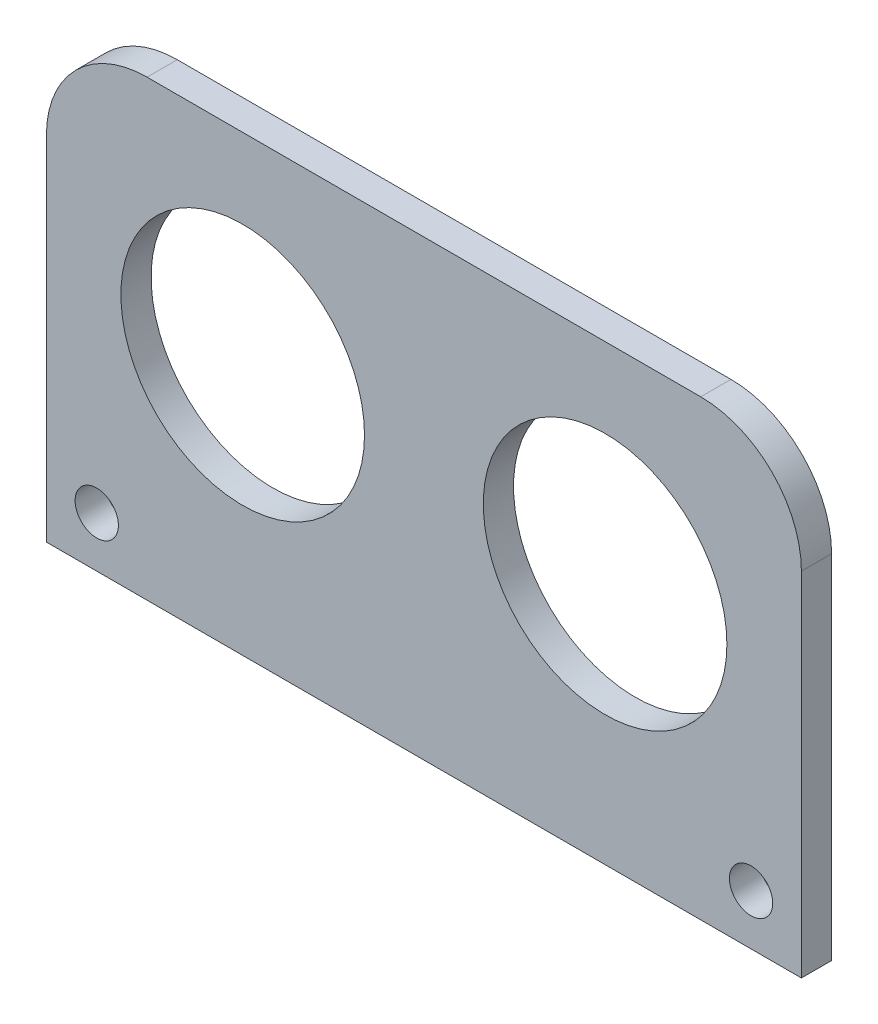
ISO-10303-21;
HEADER;
FILE_DESCRIPTION(('STEP AP214'),'2;1');
FILE_NAME('part.step','',(''),(''),'','','');
FILE_SCHEMA(('AUTOMOTIVE_DESIGN { 1 0 10303 214 1 1 1 1 }'));
ENDSEC;
DATA;
#1=APPLICATION_CONTEXT('core data for automotive mechanical design processes');
#2=APPLICATION_PROTOCOL_DEFINITION('international standard','automotive_design',2000,#1);
#3=PRODUCT_CONTEXT('',#1,'mechanical');
#4=PRODUCT('Part','Part','',(#3));
#5=PRODUCT_RELATED_PRODUCT_CATEGORY('part','',(#4));
#6=PRODUCT_DEFINITION_FORMATION('','',#4);
#7=PRODUCT_DEFINITION_CONTEXT('part definition',#1,'design');
#8=PRODUCT_DEFINITION('design','',#6,#7);
#9=PRODUCT_DEFINITION_SHAPE('','',#8);
#10=(LENGTH_UNIT() NAMED_UNIT(*) SI_UNIT(.MILLI.,.METRE.));
#11=(NAMED_UNIT(*) PLANE_ANGLE_UNIT() SI_UNIT($,.RADIAN.));
#12=(NAMED_UNIT(*) SI_UNIT($,.STERADIAN.) SOLID_ANGLE_UNIT());
#13=UNCERTAINTY_MEASURE_WITH_UNIT(LENGTH_MEASURE(1.E-05),#10,'distance_accuracy_value','');
#14=(GEOMETRIC_REPRESENTATION_CONTEXT(3) GLOBAL_UNCERTAINTY_ASSIGNED_CONTEXT((#13)) GLOBAL_UNIT_ASSIGNED_CONTEXT((#10,
#11,#12)) REPRESENTATION_CONTEXT('',''));
#15=CARTESIAN_POINT('',(0.,0.,0.));
#16=DIRECTION('',(0.,0.,1.));
#17=DIRECTION('',(1.,0.,0.));
#18=AXIS2_PLACEMENT_3D('',#15,#16,#17);
#19=CARTESIAN_POINT('',(0.,0.,3.));
#20=DIRECTION('',(0.,0.,-1.));
#21=DIRECTION('',(-1.,0.,0.));
#22=AXIS2_PLACEMENT_3D('',#19,#20,#21);
#23=PLANE('',#22);
#24=DIRECTION('',(-1.,0.,0.));
#25=VECTOR('',#24,1.);
#26=CARTESIAN_POINT('',(0.,45.,3.));
#27=LINE('',#26,#25);
#28=CARTESIAN_POINT('',(65.,45.,3.));
#29=VERTEX_POINT('',#28);
#30=CARTESIAN_POINT('',(10.,45.,3.));
#31=VERTEX_POINT('',#30);
#32=EDGE_CURVE('E116',#29,#31,#27,.T.);
#33=ORIENTED_EDGE('',*,*,#32,.T.);
#34=CARTESIAN_POINT('',(10.,35.,3.));
#35=DIRECTION('',(0.,0.,-1.));
#36=DIRECTION('',(-1.,0.,0.));
#37=AXIS2_PLACEMENT_3D('',#34,#35,#36);
#38=CIRCLE('',#37,10.);
#39=CARTESIAN_POINT('',(0.,35.,3.));
#40=VERTEX_POINT('',#39);
#41=EDGE_CURVE('E42',#31,#40,#38,.F.);
#42=ORIENTED_EDGE('',*,*,#41,.T.);
#43=DIRECTION('',(0.,-1.,0.));
#44=VECTOR('',#43,1.);
#45=CARTESIAN_POINT('',(0.,0.,3.));
#46=LINE('',#45,#44);
#47=CARTESIAN_POINT('',(0.,0.,3.));
#48=VERTEX_POINT('',#47);
#49=EDGE_CURVE('E88',#40,#48,#46,.T.);
#50=ORIENTED_EDGE('',*,*,#49,.T.);
#51=DIRECTION('',(1.,0.,0.));
#52=VECTOR('',#51,1.);
#53=CARTESIAN_POINT('',(0.,0.,3.));
#54=LINE('',#53,#52);
#55=CARTESIAN_POINT('',(75.,0.,3.));
#56=VERTEX_POINT('',#55);
#57=EDGE_CURVE('E91',#48,#56,#54,.T.);
#58=ORIENTED_EDGE('',*,*,#57,.T.);
#59=DIRECTION('',(0.,1.,0.));
#60=VECTOR('',#59,1.);
#61=CARTESIAN_POINT('',(75.,0.,3.));
#62=LINE('',#61,#60);
#63=CARTESIAN_POINT('',(75.,35.,3.));
#64=VERTEX_POINT('',#63);
#65=EDGE_CURVE('E106',#56,#64,#62,.T.);
#66=ORIENTED_EDGE('',*,*,#65,.T.);
#67=CARTESIAN_POINT('',(65.,35.,3.));
#68=DIRECTION('',(0.,0.,-1.));
#69=DIRECTION('',(-1.,0.,0.));
#70=AXIS2_PLACEMENT_3D('',#67,#68,#69);
#71=CIRCLE('',#70,10.);
#72=EDGE_CURVE('E127',#64,#29,#71,.F.);
#73=ORIENTED_EDGE('',*,*,#72,.T.);
#74=EDGE_LOOP('',(#33,#42,#50,#58,#66,#73));
#75=FACE_BOUND('',#74,.T.);
#76=CARTESIAN_POINT('',(19.5,25.,3.));
#77=DIRECTION('',(0.,0.,1.));
#78=DIRECTION('',(1.,0.,0.));
#79=AXIS2_PLACEMENT_3D('',#76,#77,#78);
#80=CIRCLE('',#79,12.1);
#81=CARTESIAN_POINT('',(31.6,25.,3.));
#82=VERTEX_POINT('',#81);
#83=EDGE_CURVE('E144',#82,#82,#80,.T.);
#84=ORIENTED_EDGE('',*,*,#83,.F.);
#85=EDGE_LOOP('',(#84));
#86=FACE_BOUND('',#85,.T.);
#87=CARTESIAN_POINT('',(55.5,25.,3.));
#88=DIRECTION('',(0.,0.,1.));
#89=DIRECTION('',(1.,0.,0.));
#90=AXIS2_PLACEMENT_3D('',#87,#88,#89);
#91=CIRCLE('',#90,12.1);
#92=CARTESIAN_POINT('',(67.6,25.,3.));
#93=VERTEX_POINT('',#92);
#94=EDGE_CURVE('E150',#93,#93,#91,.T.);
#95=ORIENTED_EDGE('',*,*,#94,.F.);
#96=EDGE_LOOP('',(#95));
#97=FACE_BOUND('',#96,.T.);
#98=CARTESIAN_POINT('',(5.,5.,3.));
#99=DIRECTION('',(0.,0.,1.));
#100=DIRECTION('',(1.,0.,0.));
#101=AXIS2_PLACEMENT_3D('',#98,#99,#100);
#102=CIRCLE('',#101,2.15);
#103=CARTESIAN_POINT('',(7.15,5.,3.));
#104=VERTEX_POINT('',#103);
#105=EDGE_CURVE('E156',#104,#104,#102,.T.);
#106=ORIENTED_EDGE('',*,*,#105,.F.);
#107=EDGE_LOOP('',(#106));
#108=FACE_BOUND('',#107,.T.);
#109=CARTESIAN_POINT('',(70.,5.00000000000001,3.));
#110=DIRECTION('',(0.,0.,1.));
#111=DIRECTION('',(-1.,0.,0.));
#112=AXIS2_PLACEMENT_3D('',#109,#110,#111);
#113=CIRCLE('',#112,2.15);
#114=CARTESIAN_POINT('',(67.85,5.00000000000001,3.));
#115=VERTEX_POINT('',#114);
#116=EDGE_CURVE('E162',#115,#115,#113,.T.);
#117=ORIENTED_EDGE('',*,*,#116,.F.);
#118=EDGE_LOOP('',(#117));
#119=FACE_BOUND('',#118,.T.);
#120=ADVANCED_FACE('F34',(#75,#86,#97,#108,#119),#23,.F.);
#121=CARTESIAN_POINT('',(0.,0.,0.));
#122=DIRECTION('',(0.,0.,-1.));
#123=DIRECTION('',(-1.,0.,0.));
#124=AXIS2_PLACEMENT_3D('',#121,#122,#123);
#125=PLANE('',#124);
#126=CARTESIAN_POINT('',(5.,5.,0.));
#127=DIRECTION('',(0.,0.,1.));
#128=DIRECTION('',(1.,0.,0.));
#129=AXIS2_PLACEMENT_3D('',#126,#127,#128);
#130=CIRCLE('',#129,2.15);
#131=CARTESIAN_POINT('',(7.15,5.,0.));
#132=VERTEX_POINT('',#131);
#133=EDGE_CURVE('E159',#132,#132,#130,.T.);
#134=ORIENTED_EDGE('',*,*,#133,.T.);
#135=EDGE_LOOP('',(#134));
#136=FACE_BOUND('',#135,.T.);
#137=CARTESIAN_POINT('',(19.5,25.,0.));
#138=DIRECTION('',(0.,0.,1.));
#139=DIRECTION('',(1.,0.,0.));
#140=AXIS2_PLACEMENT_3D('',#137,#138,#139);
#141=CIRCLE('',#140,12.1);
#142=CARTESIAN_POINT('',(31.6,25.,0.));
#143=VERTEX_POINT('',#142);
#144=EDGE_CURVE('E147',#143,#143,#141,.T.);
#145=ORIENTED_EDGE('',*,*,#144,.T.);
#146=EDGE_LOOP('',(#145));
#147=FACE_BOUND('',#146,.T.);
#148=DIRECTION('',(0.,-1.,0.));
#149=VECTOR('',#148,1.);
#150=CARTESIAN_POINT('',(0.,0.,0.));
#151=LINE('',#150,#149);
#152=CARTESIAN_POINT('',(0.,35.,0.));
#153=VERTEX_POINT('',#152);
#154=CARTESIAN_POINT('',(0.,0.,0.));
#155=VERTEX_POINT('',#154);
#156=EDGE_CURVE('E110',#153,#155,#151,.T.);
#157=ORIENTED_EDGE('',*,*,#156,.F.);
#158=CARTESIAN_POINT('',(10.,35.,0.));
#159=DIRECTION('',(0.,0.,-1.));
#160=DIRECTION('',(-1.,0.,0.));
#161=AXIS2_PLACEMENT_3D('',#158,#159,#160);
#162=CIRCLE('',#161,10.);
#163=CARTESIAN_POINT('',(10.,45.,0.));
#164=VERTEX_POINT('',#163);
#165=EDGE_CURVE('E121',#153,#164,#162,.T.);
#166=ORIENTED_EDGE('',*,*,#165,.T.);
#167=DIRECTION('',(-1.,0.,0.));
#168=VECTOR('',#167,1.);
#169=CARTESIAN_POINT('',(0.,45.,0.));
#170=LINE('',#169,#168);
#171=CARTESIAN_POINT('',(65.,45.,0.));
#172=VERTEX_POINT('',#171);
#173=EDGE_CURVE('E98',#172,#164,#170,.T.);
#174=ORIENTED_EDGE('',*,*,#173,.F.);
#175=CARTESIAN_POINT('',(65.,35.,0.));
#176=DIRECTION('',(0.,0.,-1.));
#177=DIRECTION('',(-1.,0.,0.));
#178=AXIS2_PLACEMENT_3D('',#175,#176,#177);
#179=CIRCLE('',#178,10.);
#180=CARTESIAN_POINT('',(75.,35.,0.));
#181=VERTEX_POINT('',#180);
#182=EDGE_CURVE('E114',#172,#181,#179,.T.);
#183=ORIENTED_EDGE('',*,*,#182,.T.);
#184=DIRECTION('',(0.,1.,0.));
#185=VECTOR('',#184,1.);
#186=CARTESIAN_POINT('',(75.,0.,0.));
#187=LINE('',#186,#185);
#188=CARTESIAN_POINT('',(75.,0.,0.));
#189=VERTEX_POINT('',#188);
#190=EDGE_CURVE('E138',#189,#181,#187,.T.);
#191=ORIENTED_EDGE('',*,*,#190,.F.);
#192=DIRECTION('',(1.,0.,0.));
#193=VECTOR('',#192,1.);
#194=CARTESIAN_POINT('',(0.,0.,0.));
#195=LINE('',#194,#193);
#196=EDGE_CURVE('E140',#155,#189,#195,.T.);
#197=ORIENTED_EDGE('',*,*,#196,.F.);
#198=EDGE_LOOP('',(#157,#166,#174,#183,#191,#197));
#199=FACE_BOUND('',#198,.T.);
#200=CARTESIAN_POINT('',(55.5,25.,0.));
#201=DIRECTION('',(0.,0.,1.));
#202=DIRECTION('',(1.,0.,0.));
#203=AXIS2_PLACEMENT_3D('',#200,#201,#202);
#204=CIRCLE('',#203,12.1);
#205=CARTESIAN_POINT('',(67.6,25.,0.));
#206=VERTEX_POINT('',#205);
#207=EDGE_CURVE('E153',#206,#206,#204,.T.);
#208=ORIENTED_EDGE('',*,*,#207,.T.);
#209=EDGE_LOOP('',(#208));
#210=FACE_BOUND('',#209,.T.);
#211=CARTESIAN_POINT('',(70.,5.00000000000001,0.));
#212=DIRECTION('',(0.,0.,1.));
#213=DIRECTION('',(-1.,0.,0.));
#214=AXIS2_PLACEMENT_3D('',#211,#212,#213);
#215=CIRCLE('',#214,2.15);
#216=CARTESIAN_POINT('',(67.85,5.00000000000001,0.));
#217=VERTEX_POINT('',#216);
#218=EDGE_CURVE('E165',#217,#217,#215,.T.);
#219=ORIENTED_EDGE('',*,*,#218,.T.);
#220=EDGE_LOOP('',(#219));
#221=FACE_BOUND('',#220,.T.);
#222=ADVANCED_FACE('F136',(#136,#147,#199,#210,#221),#125,.T.);
#223=CARTESIAN_POINT('',(0.,0.,3.));
#224=DIRECTION('',(1.,0.,0.));
#225=DIRECTION('',(0.,0.,-1.));
#226=AXIS2_PLACEMENT_3D('',#223,#224,#225);
#227=PLANE('',#226);
#228=ORIENTED_EDGE('',*,*,#49,.F.);
#229=DIRECTION('',(0.,0.,-1.));
#230=VECTOR('',#229,1.);
#231=CARTESIAN_POINT('',(0.,35.,3.));
#232=LINE('',#231,#230);
#233=EDGE_CURVE('E112',#40,#153,#232,.T.);
#234=ORIENTED_EDGE('',*,*,#233,.T.);
#235=ORIENTED_EDGE('',*,*,#156,.T.);
#236=DIRECTION('',(0.,0.,-1.));
#237=VECTOR('',#236,1.);
#238=CARTESIAN_POINT('',(0.,0.,3.));
#239=LINE('',#238,#237);
#240=EDGE_CURVE('E103',#48,#155,#239,.T.);
#241=ORIENTED_EDGE('',*,*,#240,.F.);
#242=EDGE_LOOP('',(#228,#234,#235,#241));
#243=FACE_BOUND('',#242,.T.);
#244=ADVANCED_FACE('F108',(#243),#227,.F.);
#245=CARTESIAN_POINT('',(0.,0.,3.));
#246=DIRECTION('',(0.,1.,0.));
#247=DIRECTION('',(-1.,0.,0.));
#248=AXIS2_PLACEMENT_3D('',#245,#246,#247);
#249=PLANE('',#248);
#250=ORIENTED_EDGE('',*,*,#196,.T.);
#251=DIRECTION('',(0.,0.,-1.));
#252=VECTOR('',#251,1.);
#253=CARTESIAN_POINT('',(75.,0.,3.));
#254=LINE('',#253,#252);
#255=EDGE_CURVE('E105',#56,#189,#254,.T.);
#256=ORIENTED_EDGE('',*,*,#255,.F.);
#257=ORIENTED_EDGE('',*,*,#57,.F.);
#258=ORIENTED_EDGE('',*,*,#240,.T.);
#259=EDGE_LOOP('',(#250,#256,#257,#258));
#260=FACE_BOUND('',#259,.T.);
#261=ADVANCED_FACE('F102',(#260),#249,.F.);
#262=CARTESIAN_POINT('',(75.,0.,3.));
#263=DIRECTION('',(-1.,0.,0.));
#264=DIRECTION('',(0.,-1.,0.));
#265=AXIS2_PLACEMENT_3D('',#262,#263,#264);
#266=PLANE('',#265);
#267=ORIENTED_EDGE('',*,*,#190,.T.);
#268=DIRECTION('',(0.,0.,-1.));
#269=VECTOR('',#268,1.);
#270=CARTESIAN_POINT('',(75.,35.,3.));
#271=LINE('',#270,#269);
#272=EDGE_CURVE('E11',#181,#64,#271,.F.);
#273=ORIENTED_EDGE('',*,*,#272,.T.);
#274=ORIENTED_EDGE('',*,*,#65,.F.);
#275=ORIENTED_EDGE('',*,*,#255,.T.);
#276=EDGE_LOOP('',(#267,#273,#274,#275));
#277=FACE_BOUND('',#276,.T.);
#278=ADVANCED_FACE('F139',(#277),#266,.F.);
#279=CARTESIAN_POINT('',(0.,45.,3.));
#280=DIRECTION('',(0.,-1.,0.));
#281=DIRECTION('',(1.,0.,0.));
#282=AXIS2_PLACEMENT_3D('',#279,#280,#281);
#283=PLANE('',#282);
#284=ORIENTED_EDGE('',*,*,#173,.T.);
#285=DIRECTION('',(0.,0.,-1.));
#286=VECTOR('',#285,1.);
#287=CARTESIAN_POINT('',(10.,45.,3.));
#288=LINE('',#287,#286);
#289=EDGE_CURVE('E55',#164,#31,#288,.F.);
#290=ORIENTED_EDGE('',*,*,#289,.T.);
#291=ORIENTED_EDGE('',*,*,#32,.F.);
#292=DIRECTION('',(0.,0.,-1.));
#293=VECTOR('',#292,1.);
#294=CARTESIAN_POINT('',(65.,45.,3.));
#295=LINE('',#294,#293);
#296=EDGE_CURVE('E123',#29,#172,#295,.T.);
#297=ORIENTED_EDGE('',*,*,#296,.T.);
#298=EDGE_LOOP('',(#284,#290,#291,#297));
#299=FACE_BOUND('',#298,.T.);
#300=ADVANCED_FACE('F131',(#299),#283,.F.);
#301=CARTESIAN_POINT('',(19.5,25.,3.));
#302=DIRECTION('',(0.,0.,-1.));
#303=DIRECTION('',(-1.,0.,0.));
#304=AXIS2_PLACEMENT_3D('',#301,#302,#303);
#305=CYLINDRICAL_SURFACE('',#304,12.1);
#306=ORIENTED_EDGE('',*,*,#83,.T.);
#307=EDGE_LOOP('',(#306));
#308=FACE_BOUND('',#307,.T.);
#309=ORIENTED_EDGE('',*,*,#144,.F.);
#310=EDGE_LOOP('',(#309));
#311=FACE_BOUND('',#310,.T.);
#312=ADVANCED_FACE('F182',(#308,#311),#305,.F.);
#313=CARTESIAN_POINT('',(55.5,25.,3.));
#314=DIRECTION('',(0.,0.,-1.));
#315=DIRECTION('',(-1.,0.,0.));
#316=AXIS2_PLACEMENT_3D('',#313,#314,#315);
#317=CYLINDRICAL_SURFACE('',#316,12.1);
#318=ORIENTED_EDGE('',*,*,#94,.T.);
#319=EDGE_LOOP('',(#318));
#320=FACE_BOUND('',#319,.T.);
#321=ORIENTED_EDGE('',*,*,#207,.F.);
#322=EDGE_LOOP('',(#321));
#323=FACE_BOUND('',#322,.T.);
#324=ADVANCED_FACE('F204',(#320,#323),#317,.F.);
#325=CARTESIAN_POINT('',(5.,5.,3.));
#326=DIRECTION('',(0.,0.,-1.));
#327=DIRECTION('',(-1.,0.,0.));
#328=AXIS2_PLACEMENT_3D('',#325,#326,#327);
#329=CYLINDRICAL_SURFACE('',#328,2.15);
#330=ORIENTED_EDGE('',*,*,#105,.T.);
#331=EDGE_LOOP('',(#330));
#332=FACE_BOUND('',#331,.T.);
#333=ORIENTED_EDGE('',*,*,#133,.F.);
#334=EDGE_LOOP('',(#333));
#335=FACE_BOUND('',#334,.T.);
#336=ADVANCED_FACE('F199',(#332,#335),#329,.F.);
#337=CARTESIAN_POINT('',(70.,5.00000000000001,3.));
#338=DIRECTION('',(0.,0.,-1.));
#339=DIRECTION('',(-1.,0.,0.));
#340=AXIS2_PLACEMENT_3D('',#337,#338,#339);
#341=CYLINDRICAL_SURFACE('',#340,2.15);
#342=ORIENTED_EDGE('',*,*,#116,.T.);
#343=EDGE_LOOP('',(#342));
#344=FACE_BOUND('',#343,.T.);
#345=ORIENTED_EDGE('',*,*,#218,.F.);
#346=EDGE_LOOP('',(#345));
#347=FACE_BOUND('',#346,.T.);
#348=ADVANCED_FACE('F171',(#344,#347),#341,.F.);
#349=CARTESIAN_POINT('',(10.,35.,3.));
#350=DIRECTION('',(0.,0.,-1.));
#351=DIRECTION('',(-1.,0.,0.));
#352=AXIS2_PLACEMENT_3D('',#349,#350,#351);
#353=CYLINDRICAL_SURFACE('',#352,10.);
#354=ORIENTED_EDGE('',*,*,#41,.F.);
#355=ORIENTED_EDGE('',*,*,#289,.F.);
#356=ORIENTED_EDGE('',*,*,#165,.F.);
#357=ORIENTED_EDGE('',*,*,#233,.F.);
#358=EDGE_LOOP('',(#354,#355,#356,#357));
#359=FACE_BOUND('',#358,.T.);
#360=ADVANCED_FACE('F192',(#359),#353,.T.);
#361=CARTESIAN_POINT('',(65.,35.,3.));
#362=DIRECTION('',(0.,0.,-1.));
#363=DIRECTION('',(-1.,0.,0.));
#364=AXIS2_PLACEMENT_3D('',#361,#362,#363);
#365=CYLINDRICAL_SURFACE('',#364,10.);
#366=ORIENTED_EDGE('',*,*,#72,.F.);
#367=ORIENTED_EDGE('',*,*,#272,.F.);
#368=ORIENTED_EDGE('',*,*,#182,.F.);
#369=ORIENTED_EDGE('',*,*,#296,.F.);
#370=EDGE_LOOP('',(#366,#367,#368,#369));
#371=FACE_BOUND('',#370,.T.);
#372=ADVANCED_FACE('F36',(#371),#365,.T.);
#373=CLOSED_SHELL('',(#120,#222,#244,#261,#278,#300,#312,#324,#336,#348,#360,#372));
#374=MANIFOLD_SOLID_BREP('B2',#373);
#375=ADVANCED_BREP_SHAPE_REPRESENTATION('',(#18,#374),#14);
#376=SHAPE_DEFINITION_REPRESENTATION(#9,#375);
ENDSEC;
END-ISO-10303-21;
